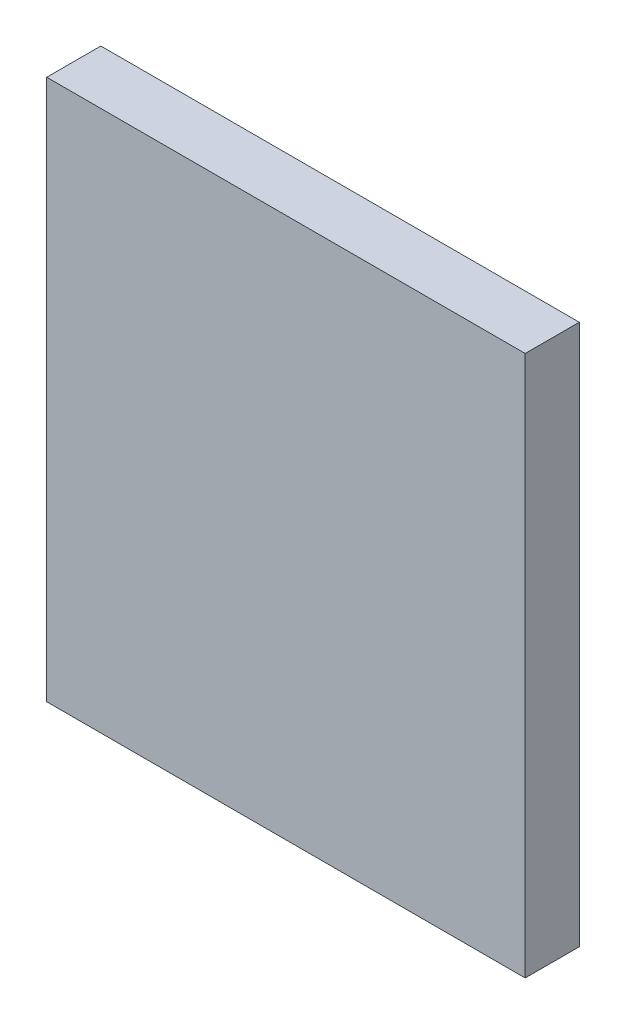
ISO-10303-21;
HEADER;
FILE_DESCRIPTION(('STEP AP214'),'2;1');
FILE_NAME('part.step','',(''),(''),'','','');
FILE_SCHEMA(('AUTOMOTIVE_DESIGN { 1 0 10303 214 1 1 1 1 }'));
ENDSEC;
DATA;
#1=APPLICATION_CONTEXT('core data for automotive mechanical design processes');
#2=APPLICATION_PROTOCOL_DEFINITION('international standard','automotive_design',2000,#1);
#3=PRODUCT_CONTEXT('',#1,'mechanical');
#4=PRODUCT('Part','Part','',(#3));
#5=PRODUCT_RELATED_PRODUCT_CATEGORY('part','',(#4));
#6=PRODUCT_DEFINITION_FORMATION('','',#4);
#7=PRODUCT_DEFINITION_CONTEXT('part definition',#1,'design');
#8=PRODUCT_DEFINITION('design','',#6,#7);
#9=PRODUCT_DEFINITION_SHAPE('','',#8);
#10=(LENGTH_UNIT() NAMED_UNIT(*) SI_UNIT(.MILLI.,.METRE.));
#11=(NAMED_UNIT(*) PLANE_ANGLE_UNIT() SI_UNIT($,.RADIAN.));
#12=(NAMED_UNIT(*) SI_UNIT($,.STERADIAN.) SOLID_ANGLE_UNIT());
#13=UNCERTAINTY_MEASURE_WITH_UNIT(LENGTH_MEASURE(1.E-05),#10,'distance_accuracy_value','');
#14=(GEOMETRIC_REPRESENTATION_CONTEXT(3) GLOBAL_UNCERTAINTY_ASSIGNED_CONTEXT((#13)) GLOBAL_UNIT_ASSIGNED_CONTEXT((#10,
#11,#12)) REPRESENTATION_CONTEXT('',''));
#15=CARTESIAN_POINT('',(0.,0.,0.));
#16=DIRECTION('',(0.,0.,1.));
#17=DIRECTION('',(1.,0.,0.));
#18=AXIS2_PLACEMENT_3D('',#15,#16,#17);
#19=CARTESIAN_POINT('',(0.,0.,1.3));
#20=DIRECTION('',(0.,0.,1.));
#21=DIRECTION('',(1.,0.,0.));
#22=AXIS2_PLACEMENT_3D('',#19,#20,#21);
#23=PLANE('',#22);
#24=DIRECTION('',(0.,1.,0.));
#25=VECTOR('',#24,1.);
#26=CARTESIAN_POINT('',(0.,0.,1.3));
#27=LINE('',#26,#25);
#28=CARTESIAN_POINT('',(0.,0.,1.3));
#29=VERTEX_POINT('',#28);
#30=CARTESIAN_POINT('',(0.,13.,1.3));
#31=VERTEX_POINT('',#30);
#32=EDGE_CURVE('E107',#29,#31,#27,.T.);
#33=ORIENTED_EDGE('',*,*,#32,.F.);
#34=DIRECTION('',(1.,0.,0.));
#35=VECTOR('',#34,1.);
#36=CARTESIAN_POINT('',(0.,0.,1.3));
#37=LINE('',#36,#35);
#38=CARTESIAN_POINT('',(11.5,0.,1.3));
#39=VERTEX_POINT('',#38);
#40=EDGE_CURVE('E78',#29,#39,#37,.T.);
#41=ORIENTED_EDGE('',*,*,#40,.T.);
#42=DIRECTION('',(0.,1.,0.));
#43=VECTOR('',#42,1.);
#44=CARTESIAN_POINT('',(11.5,0.,1.3));
#45=LINE('',#44,#43);
#46=CARTESIAN_POINT('',(11.5,13.,1.3));
#47=VERTEX_POINT('',#46);
#48=EDGE_CURVE('E89',#39,#47,#45,.T.);
#49=ORIENTED_EDGE('',*,*,#48,.T.);
#50=DIRECTION('',(1.,0.,0.));
#51=VECTOR('',#50,1.);
#52=CARTESIAN_POINT('',(0.,13.,1.3));
#53=LINE('',#52,#51);
#54=EDGE_CURVE('E11',#31,#47,#53,.T.);
#55=ORIENTED_EDGE('',*,*,#54,.F.);
#56=EDGE_LOOP('',(#33,#41,#49,#55));
#57=FACE_BOUND('',#56,.T.);
#58=ADVANCED_FACE('F17',(#57),#23,.T.);
#59=CARTESIAN_POINT('',(0.,0.,0.));
#60=DIRECTION('',(0.,0.,1.));
#61=DIRECTION('',(1.,0.,0.));
#62=AXIS2_PLACEMENT_3D('',#59,#60,#61);
#63=PLANE('',#62);
#64=DIRECTION('',(1.,0.,0.));
#65=VECTOR('',#64,1.);
#66=CARTESIAN_POINT('',(0.,13.,0.));
#67=LINE('',#66,#65);
#68=CARTESIAN_POINT('',(0.,13.,0.));
#69=VERTEX_POINT('',#68);
#70=CARTESIAN_POINT('',(11.5,13.,0.));
#71=VERTEX_POINT('',#70);
#72=EDGE_CURVE('E20',#69,#71,#67,.T.);
#73=ORIENTED_EDGE('',*,*,#72,.T.);
#74=DIRECTION('',(0.,1.,0.));
#75=VECTOR('',#74,1.);
#76=CARTESIAN_POINT('',(11.5,0.,0.));
#77=LINE('',#76,#75);
#78=CARTESIAN_POINT('',(11.5,0.,0.));
#79=VERTEX_POINT('',#78);
#80=EDGE_CURVE('E81',#79,#71,#77,.T.);
#81=ORIENTED_EDGE('',*,*,#80,.F.);
#82=DIRECTION('',(1.,0.,0.));
#83=VECTOR('',#82,1.);
#84=CARTESIAN_POINT('',(0.,0.,0.));
#85=LINE('',#84,#83);
#86=CARTESIAN_POINT('',(0.,0.,0.));
#87=VERTEX_POINT('',#86);
#88=EDGE_CURVE('E75',#87,#79,#85,.T.);
#89=ORIENTED_EDGE('',*,*,#88,.F.);
#90=DIRECTION('',(0.,1.,0.));
#91=VECTOR('',#90,1.);
#92=CARTESIAN_POINT('',(0.,0.,0.));
#93=LINE('',#92,#91);
#94=EDGE_CURVE('E96',#87,#69,#93,.T.);
#95=ORIENTED_EDGE('',*,*,#94,.T.);
#96=EDGE_LOOP('',(#73,#81,#89,#95));
#97=FACE_BOUND('',#96,.T.);
#98=ADVANCED_FACE('F85',(#97),#63,.F.);
#99=CARTESIAN_POINT('',(0.,13.,0.));
#100=DIRECTION('',(0.,1.,0.));
#101=DIRECTION('',(1.,0.,0.));
#102=AXIS2_PLACEMENT_3D('',#99,#100,#101);
#103=PLANE('',#102);
#104=ORIENTED_EDGE('',*,*,#72,.F.);
#105=DIRECTION('',(0.,0.,1.));
#106=VECTOR('',#105,1.);
#107=CARTESIAN_POINT('',(0.,13.,0.));
#108=LINE('',#107,#106);
#109=EDGE_CURVE('E115',#69,#31,#108,.T.);
#110=ORIENTED_EDGE('',*,*,#109,.T.);
#111=ORIENTED_EDGE('',*,*,#54,.T.);
#112=DIRECTION('',(0.,0.,1.));
#113=VECTOR('',#112,1.);
#114=CARTESIAN_POINT('',(11.5,13.,0.));
#115=LINE('',#114,#113);
#116=EDGE_CURVE('E88',#71,#47,#115,.T.);
#117=ORIENTED_EDGE('',*,*,#116,.F.);
#118=EDGE_LOOP('',(#104,#110,#111,#117));
#119=FACE_BOUND('',#118,.T.);
#120=ADVANCED_FACE('F124',(#119),#103,.T.);
#121=CARTESIAN_POINT('',(0.,0.,0.));
#122=DIRECTION('',(0.,1.,0.));
#123=DIRECTION('',(1.,0.,0.));
#124=AXIS2_PLACEMENT_3D('',#121,#122,#123);
#125=PLANE('',#124);
#126=DIRECTION('',(0.,0.,1.));
#127=VECTOR('',#126,1.);
#128=CARTESIAN_POINT('',(11.5,0.,0.));
#129=LINE('',#128,#127);
#130=EDGE_CURVE('E72',#79,#39,#129,.T.);
#131=ORIENTED_EDGE('',*,*,#130,.T.);
#132=ORIENTED_EDGE('',*,*,#40,.F.);
#133=DIRECTION('',(0.,0.,1.));
#134=VECTOR('',#133,1.);
#135=CARTESIAN_POINT('',(0.,0.,0.));
#136=LINE('',#135,#134);
#137=EDGE_CURVE('E76',#87,#29,#136,.T.);
#138=ORIENTED_EDGE('',*,*,#137,.F.);
#139=ORIENTED_EDGE('',*,*,#88,.T.);
#140=EDGE_LOOP('',(#131,#132,#138,#139));
#141=FACE_BOUND('',#140,.T.);
#142=ADVANCED_FACE('F71',(#141),#125,.F.);
#143=CARTESIAN_POINT('',(11.5,0.,0.));
#144=DIRECTION('',(1.,0.,0.));
#145=DIRECTION('',(0.,1.,0.));
#146=AXIS2_PLACEMENT_3D('',#143,#144,#145);
#147=PLANE('',#146);
#148=ORIENTED_EDGE('',*,*,#130,.F.);
#149=ORIENTED_EDGE('',*,*,#80,.T.);
#150=ORIENTED_EDGE('',*,*,#116,.T.);
#151=ORIENTED_EDGE('',*,*,#48,.F.);
#152=EDGE_LOOP('',(#148,#149,#150,#151));
#153=FACE_BOUND('',#152,.T.);
#154=ADVANCED_FACE('F90',(#153),#147,.T.);
#155=CARTESIAN_POINT('',(0.,0.,0.));
#156=DIRECTION('',(1.,0.,0.));
#157=DIRECTION('',(0.,1.,0.));
#158=AXIS2_PLACEMENT_3D('',#155,#156,#157);
#159=PLANE('',#158);
#160=ORIENTED_EDGE('',*,*,#32,.T.);
#161=ORIENTED_EDGE('',*,*,#109,.F.);
#162=ORIENTED_EDGE('',*,*,#94,.F.);
#163=ORIENTED_EDGE('',*,*,#137,.T.);
#164=EDGE_LOOP('',(#160,#161,#162,#163));
#165=FACE_BOUND('',#164,.T.);
#166=ADVANCED_FACE('F109',(#165),#159,.F.);
#167=CLOSED_SHELL('',(#58,#98,#120,#142,#154,#166));
#168=MANIFOLD_SOLID_BREP('B1',#167);
#169=ADVANCED_BREP_SHAPE_REPRESENTATION('',(#18,#168),#14);
#170=SHAPE_DEFINITION_REPRESENTATION(#9,#169);
ENDSEC;
END-ISO-10303-21;
